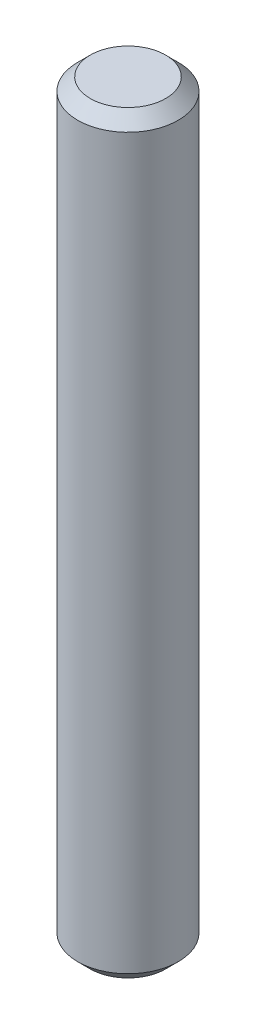
ISO-10303-21;
HEADER;
FILE_DESCRIPTION(('STEP AP214'),'2;1');
FILE_NAME('part.step','',(''),(''),'','','');
FILE_SCHEMA(('AUTOMOTIVE_DESIGN { 1 0 10303 214 1 1 1 1 }'));
ENDSEC;
DATA;
#1=APPLICATION_CONTEXT('core data for automotive mechanical design processes');
#2=APPLICATION_PROTOCOL_DEFINITION('international standard','automotive_design',2000,#1);
#3=PRODUCT_CONTEXT('',#1,'mechanical');
#4=PRODUCT('Part','Part','',(#3));
#5=PRODUCT_RELATED_PRODUCT_CATEGORY('part','',(#4));
#6=PRODUCT_DEFINITION_FORMATION('','',#4);
#7=PRODUCT_DEFINITION_CONTEXT('part definition',#1,'design');
#8=PRODUCT_DEFINITION('design','',#6,#7);
#9=PRODUCT_DEFINITION_SHAPE('','',#8);
#10=(LENGTH_UNIT() NAMED_UNIT(*) SI_UNIT(.MILLI.,.METRE.));
#11=(NAMED_UNIT(*) PLANE_ANGLE_UNIT() SI_UNIT($,.RADIAN.));
#12=(NAMED_UNIT(*) SI_UNIT($,.STERADIAN.) SOLID_ANGLE_UNIT());
#13=UNCERTAINTY_MEASURE_WITH_UNIT(LENGTH_MEASURE(1.E-05),#10,'distance_accuracy_value','');
#14=(GEOMETRIC_REPRESENTATION_CONTEXT(3) GLOBAL_UNCERTAINTY_ASSIGNED_CONTEXT((#13)) GLOBAL_UNIT_ASSIGNED_CONTEXT((#10,
#11,#12)) REPRESENTATION_CONTEXT('',''));
#15=CARTESIAN_POINT('',(0.,0.,0.));
#16=DIRECTION('',(0.,0.,1.));
#17=DIRECTION('',(1.,0.,0.));
#18=AXIS2_PLACEMENT_3D('',#15,#16,#17);
#19=CARTESIAN_POINT('',(0.,15.,0.));
#20=DIRECTION('',(0.,-1.,0.));
#21=DIRECTION('',(0.,0.,-1.));
#22=AXIS2_PLACEMENT_3D('',#19,#20,#21);
#23=CYLINDRICAL_SURFACE('',#22,2.);
#24=CARTESIAN_POINT('',(0.,-14.5,0.));
#25=DIRECTION('',(0.,1.,0.));
#26=DIRECTION('',(0.,0.,1.));
#27=AXIS2_PLACEMENT_3D('',#24,#25,#26);
#28=CIRCLE('',#27,2.);
#29=CARTESIAN_POINT('',(0.,-14.5,2.));
#30=VERTEX_POINT('',#29);
#31=EDGE_CURVE('E59',#30,#30,#28,.T.);
#32=ORIENTED_EDGE('',*,*,#31,.T.);
#33=EDGE_LOOP('',(#32));
#34=FACE_BOUND('',#33,.T.);
#35=CARTESIAN_POINT('',(0.,14.5,0.));
#36=DIRECTION('',(0.,1.,0.));
#37=DIRECTION('',(0.,0.,1.));
#38=AXIS2_PLACEMENT_3D('',#35,#36,#37);
#39=CIRCLE('',#38,2.);
#40=CARTESIAN_POINT('',(0.,14.5,2.));
#41=VERTEX_POINT('',#40);
#42=EDGE_CURVE('E64',#41,#41,#39,.F.);
#43=ORIENTED_EDGE('',*,*,#42,.T.);
#44=EDGE_LOOP('',(#43));
#45=FACE_BOUND('',#44,.T.);
#46=ADVANCED_FACE('F45',(#34,#45),#23,.T.);
#47=CARTESIAN_POINT('',(0.,15.,0.));
#48=DIRECTION('',(0.,1.,0.));
#49=DIRECTION('',(0.,0.,1.));
#50=AXIS2_PLACEMENT_3D('',#47,#48,#49);
#51=PLANE('',#50);
#52=CARTESIAN_POINT('',(0.,15.,0.));
#53=DIRECTION('',(0.,1.,0.));
#54=DIRECTION('',(0.,0.,1.));
#55=AXIS2_PLACEMENT_3D('',#52,#53,#54);
#56=CIRCLE('',#55,1.5);
#57=CARTESIAN_POINT('',(0.,15.,1.5));
#58=VERTEX_POINT('',#57);
#59=EDGE_CURVE('E10',#58,#58,#56,.T.);
#60=ORIENTED_EDGE('',*,*,#59,.T.);
#61=EDGE_LOOP('',(#60));
#62=FACE_BOUND('',#61,.T.);
#63=ADVANCED_FACE('F81',(#62),#51,.T.);
#64=CARTESIAN_POINT('',(0.,-15.,0.));
#65=DIRECTION('',(0.,1.,0.));
#66=DIRECTION('',(0.,0.,1.));
#67=AXIS2_PLACEMENT_3D('',#64,#65,#66);
#68=PLANE('',#67);
#69=CARTESIAN_POINT('',(0.,-15.,0.));
#70=DIRECTION('',(0.,1.,0.));
#71=DIRECTION('',(0.,0.,1.));
#72=AXIS2_PLACEMENT_3D('',#69,#70,#71);
#73=CIRCLE('',#72,1.5);
#74=CARTESIAN_POINT('',(0.,-15.,1.5));
#75=VERTEX_POINT('',#74);
#76=EDGE_CURVE('E54',#75,#75,#73,.F.);
#77=ORIENTED_EDGE('',*,*,#76,.T.);
#78=EDGE_LOOP('',(#77));
#79=FACE_BOUND('',#78,.T.);
#80=ADVANCED_FACE('F78',(#79),#68,.F.);
#81=CARTESIAN_POINT('',(0.,-14.5,0.));
#82=DIRECTION('',(0.,1.,0.));
#83=DIRECTION('',(0.,0.,1.));
#84=AXIS2_PLACEMENT_3D('',#81,#82,#83);
#85=CONICAL_SURFACE('',#84,2.,0.78539816339745);
#86=ORIENTED_EDGE('',*,*,#76,.F.);
#87=EDGE_LOOP('',(#86));
#88=FACE_BOUND('',#87,.T.);
#89=ORIENTED_EDGE('',*,*,#31,.F.);
#90=EDGE_LOOP('',(#89));
#91=FACE_BOUND('',#90,.T.);
#92=ADVANCED_FACE('F74',(#88,#91),#85,.T.);
#93=CARTESIAN_POINT('',(0.,15.,0.));
#94=DIRECTION('',(0.,-1.,0.));
#95=DIRECTION('',(0.,0.,-1.));
#96=AXIS2_PLACEMENT_3D('',#93,#94,#95);
#97=CONICAL_SURFACE('',#96,1.5,0.785398163397448);
#98=ORIENTED_EDGE('',*,*,#42,.F.);
#99=EDGE_LOOP('',(#98));
#100=FACE_BOUND('',#99,.T.);
#101=ORIENTED_EDGE('',*,*,#59,.F.);
#102=EDGE_LOOP('',(#101));
#103=FACE_BOUND('',#102,.T.);
#104=ADVANCED_FACE('F48',(#100,#103),#97,.T.);
#105=CLOSED_SHELL('',(#46,#63,#80,#92,#104));
#106=MANIFOLD_SOLID_BREP('B2',#105);
#107=ADVANCED_BREP_SHAPE_REPRESENTATION('',(#18,#106),#14);
#108=SHAPE_DEFINITION_REPRESENTATION(#9,#107);
ENDSEC;
END-ISO-10303-21;
